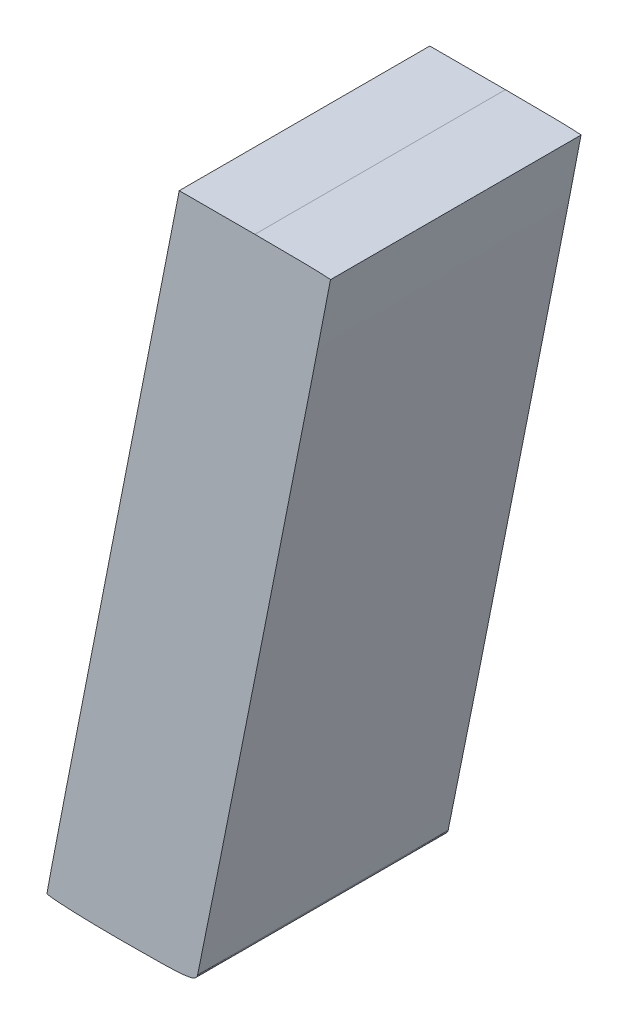
ISO-10303-21;
HEADER;
FILE_DESCRIPTION(('STEP AP214'),'2;1');
FILE_NAME('part.step','',(''),(''),'','','');
FILE_SCHEMA(('AUTOMOTIVE_DESIGN { 1 0 10303 214 1 1 1 1 }'));
ENDSEC;
DATA;
#1=APPLICATION_CONTEXT('core data for automotive mechanical design processes');
#2=APPLICATION_PROTOCOL_DEFINITION('international standard','automotive_design',2000,#1);
#3=PRODUCT_CONTEXT('',#1,'mechanical');
#4=PRODUCT('Part','Part','',(#3));
#5=PRODUCT_RELATED_PRODUCT_CATEGORY('part','',(#4));
#6=PRODUCT_DEFINITION_FORMATION('','',#4);
#7=PRODUCT_DEFINITION_CONTEXT('part definition',#1,'design');
#8=PRODUCT_DEFINITION('design','',#6,#7);
#9=PRODUCT_DEFINITION_SHAPE('','',#8);
#10=(LENGTH_UNIT() NAMED_UNIT(*) SI_UNIT(.MILLI.,.METRE.));
#11=(NAMED_UNIT(*) PLANE_ANGLE_UNIT() SI_UNIT($,.RADIAN.));
#12=(NAMED_UNIT(*) SI_UNIT($,.STERADIAN.) SOLID_ANGLE_UNIT());
#13=UNCERTAINTY_MEASURE_WITH_UNIT(LENGTH_MEASURE(1.E-05),#10,'distance_accuracy_value','');
#14=(GEOMETRIC_REPRESENTATION_CONTEXT(3) GLOBAL_UNCERTAINTY_ASSIGNED_CONTEXT((#13)) GLOBAL_UNIT_ASSIGNED_CONTEXT((#10,
#11,#12)) REPRESENTATION_CONTEXT('',''));
#15=CARTESIAN_POINT('',(0.,0.,0.));
#16=DIRECTION('',(0.,0.,1.));
#17=DIRECTION('',(1.,0.,0.));
#18=AXIS2_PLACEMENT_3D('',#15,#16,#17);
#19=CARTESIAN_POINT('',(0.466752008709,0.125494888964,0.));
#20=CARTESIAN_POINT('',(0.466752008709,0.125494888964,0.1));
#21=CARTESIAN_POINT('',(0.466752008709,0.125819781888,0.));
#22=CARTESIAN_POINT('',(0.466752008709,0.125819781888,0.1));
#23=CARTESIAN_POINT('',(0.453167898463,0.126085581458,0.));
#24=CARTESIAN_POINT('',(0.453167898463,0.126085581458,0.1));
#25=CARTESIAN_POINT('',(0.436565076449,0.126085581458,0.));
#26=CARTESIAN_POINT('',(0.436565076449,0.126085581458,0.1));
#27=B_SPLINE_SURFACE_WITH_KNOTS('',3,1,((#19,#20),(#21,#22),(#23,#24),(#25,#26)),.UNSPECIFIED.,
.F.,.F.,.F.,(4,4),(2,2),(0.,1.),(0.,0.01),.UNSPECIFIED.);
#28=CARTESIAN_POINT('',(0.466752008709,0.125494888964,0.));
#29=CARTESIAN_POINT('',(0.466752008709,0.125819781888,0.));
#30=CARTESIAN_POINT('',(0.453167898463,0.126085581458,0.));
#31=CARTESIAN_POINT('',(0.436565076449,0.126085581458,0.));
#32=B_SPLINE_CURVE_WITH_KNOTS('',3,(#28,#29,#30,#31),.UNSPECIFIED.,.F.,.F.,(4,4),(0.,1.),.UNSPECIFIED.);
#33=CARTESIAN_POINT('',(0.466752008709,0.125494888964,0.));
#34=VERTEX_POINT('',#33);
#35=CARTESIAN_POINT('',(0.436565076449,0.126085581458,0.));
#36=VERTEX_POINT('',#35);
#37=EDGE_CURVE('E11',#34,#36,#32,.T.);
#38=DIRECTION('',(0.,0.,1.));
#39=VECTOR('',#38,1.);
#40=CARTESIAN_POINT('',(0.436565076449,0.126085581458,0.));
#41=LINE('',#40,#39);
#42=CARTESIAN_POINT('',(0.436565076449,0.126085581458,0.1));
#43=VERTEX_POINT('',#42);
#44=EDGE_CURVE('E26',#36,#43,#41,.T.);
#45=CARTESIAN_POINT('',(0.466752008709,0.125494888964,0.1));
#46=CARTESIAN_POINT('',(0.466752008709,0.125819781888,0.1));
#47=CARTESIAN_POINT('',(0.453167898463,0.126085581458,0.1));
#48=CARTESIAN_POINT('',(0.436565076449,0.126085581458,0.1));
#49=B_SPLINE_CURVE_WITH_KNOTS('',3,(#45,#46,#47,#48),.UNSPECIFIED.,.F.,.F.,(4,4),(0.,1.),.UNSPECIFIED.);
#50=CARTESIAN_POINT('',(0.466752008709,0.125494888964,0.1));
#51=VERTEX_POINT('',#50);
#52=EDGE_CURVE('E96',#51,#43,#49,.T.);
#53=DIRECTION('',(0.,0.,1.));
#54=VECTOR('',#53,1.);
#55=CARTESIAN_POINT('',(0.466752008709,0.125494888964,0.));
#56=LINE('',#55,#54);
#57=EDGE_CURVE('E316',#34,#51,#56,.T.);
#58=ORIENTED_EDGE('',*,*,#37,.T.);
#59=ORIENTED_EDGE('',*,*,#44,.T.);
#60=ORIENTED_EDGE('',*,*,#52,.F.);
#61=ORIENTED_EDGE('',*,*,#57,.F.);
#62=EDGE_LOOP('',(#58,#59,#60,#61));
#63=FACE_BOUND('',#62,.T.);
#64=ADVANCED_FACE('F17',(#63),#27,.T.);
#65=CARTESIAN_POINT('',(0.413704830069,-0.14138271291666,0.));
#66=CARTESIAN_POINT('',(0.413704830069,-0.14138271291666,0.1));
#67=CARTESIAN_POINT('',(0.414569554781,-0.13850351115666,0.));
#68=CARTESIAN_POINT('',(0.414569554781,-0.13850351115666,0.1));
#69=CARTESIAN_POINT('',(0.466752008709,0.124023766684,0.));
#70=CARTESIAN_POINT('',(0.466752008709,0.124023766684,0.1));
#71=CARTESIAN_POINT('',(0.466752008709,0.125494888964,0.));
#72=CARTESIAN_POINT('',(0.466752008709,0.125494888964,0.1));
#73=B_SPLINE_SURFACE_WITH_KNOTS('',3,1,((#65,#66),(#67,#68),(#69,#70),(#71,#72)),.UNSPECIFIED.,
.F.,.F.,.F.,(4,4),(2,2),(0.,1.),(0.,0.01),.UNSPECIFIED.);
#74=CARTESIAN_POINT('',(0.413704830069,-0.14138271291666,0.));
#75=CARTESIAN_POINT('',(0.414569554781,-0.13850351115666,0.));
#76=CARTESIAN_POINT('',(0.466752008709,0.124023766684,0.));
#77=CARTESIAN_POINT('',(0.466752008709,0.125494888964,0.));
#78=B_SPLINE_CURVE_WITH_KNOTS('',3,(#74,#75,#76,#77),.UNSPECIFIED.,.F.,.F.,(4,4),(0.,1.),.UNSPECIFIED.);
#79=CARTESIAN_POINT('',(0.413704830069,-0.14138271291666,0.));
#80=VERTEX_POINT('',#79);
#81=EDGE_CURVE('E315',#80,#34,#78,.T.);
#82=CARTESIAN_POINT('',(0.466752008709,0.125494888964,0.1));
#83=CARTESIAN_POINT('',(0.466752008709,0.124023766684,0.1));
#84=CARTESIAN_POINT('',(0.414569554781,-0.13850351115666,0.1));
#85=CARTESIAN_POINT('',(0.413704830069,-0.14138271291666,0.1));
#86=B_SPLINE_CURVE_WITH_KNOTS('',3,(#82,#83,#84,#85),.UNSPECIFIED.,.F.,.F.,(4,4),(0.,1.),.UNSPECIFIED.);
#87=CARTESIAN_POINT('',(0.413704830069,-0.14138271291666,0.1));
#88=VERTEX_POINT('',#87);
#89=EDGE_CURVE('E207',#88,#51,#86,.F.);
#90=CARTESIAN_POINT('',(0.413704830069,-0.14138271291666,0.));
#91=CARTESIAN_POINT('',(0.413704830069,-0.14138271291666,0.00416666666666667));
#92=CARTESIAN_POINT('',(0.413704830069,-0.14138271291666,0.00833333333333334));
#93=CARTESIAN_POINT('',(0.413704830069,-0.14138271291666,0.0166666666666667));
#94=CARTESIAN_POINT('',(0.413704830069,-0.14138271291666,0.0208333333333333));
#95=CARTESIAN_POINT('',(0.413704830069,-0.14138271291666,0.0291666666666667));
#96=CARTESIAN_POINT('',(0.413704830069,-0.14138271291666,0.0333333333333333));
#97=CARTESIAN_POINT('',(0.413704830069,-0.14138271291666,0.0416666666666667));
#98=CARTESIAN_POINT('',(0.413704830069,-0.14138271291666,0.0458333333333333));
#99=CARTESIAN_POINT('',(0.413704830069,-0.14138271291666,0.0541666666666667));
#100=CARTESIAN_POINT('',(0.413704830069,-0.14138271291666,0.0583333333333333));
#101=CARTESIAN_POINT('',(0.413704830069,-0.14138271291666,0.0666666666666667));
#102=CARTESIAN_POINT('',(0.413704830069,-0.14138271291666,0.0708333333333333));
#103=CARTESIAN_POINT('',(0.413704830069,-0.14138271291666,0.0791666666666667));
#104=CARTESIAN_POINT('',(0.413704830069,-0.14138271291666,0.0833333333333333));
#105=CARTESIAN_POINT('',(0.413704830069,-0.14138271291666,0.0916666666666667));
#106=CARTESIAN_POINT('',(0.413704830069,-0.14138271291666,0.0958333333333333));
#107=CARTESIAN_POINT('',(0.413704830069,-0.14138271291666,0.1));
#108=B_SPLINE_CURVE_WITH_KNOTS('',3,(#90,#91,#92,#93,#94,#95,#96,#97,#98,#99,#100,#101,#102,
#103,#104,#105,#106,#107),.UNSPECIFIED.,.F.,.F.,(4,2,2,2,2,2,2,2,4),(0.,0.0125,0.025,0.0375,
0.05,0.0625,0.075,0.0875,0.1),.UNSPECIFIED.);
#109=EDGE_CURVE('E159',#80,#88,#108,.T.);
#110=ORIENTED_EDGE('',*,*,#81,.T.);
#111=ORIENTED_EDGE('',*,*,#57,.T.);
#112=ORIENTED_EDGE('',*,*,#89,.F.);
#113=ORIENTED_EDGE('',*,*,#109,.F.);
#114=EDGE_LOOP('',(#110,#111,#112,#113));
#115=FACE_BOUND('',#114,.T.);
#116=ADVANCED_FACE('F165',(#115),#73,.T.);
#117=CARTESIAN_POINT('',(0.383188054171,-0.14462756291666,0.));
#118=CARTESIAN_POINT('',(0.383188054171,-0.14462756291666,0.1));
#119=CARTESIAN_POINT('',(0.409716149197,-0.14462756291666,0.));
#120=CARTESIAN_POINT('',(0.409716149197,-0.14462756291666,0.1));
#121=CARTESIAN_POINT('',(0.412829740379,-0.14429649550666,0.));
#122=CARTESIAN_POINT('',(0.412829740379,-0.14429649550666,0.1));
#123=CARTESIAN_POINT('',(0.413704830069,-0.14138271291666,0.));
#124=CARTESIAN_POINT('',(0.413704830069,-0.14138271291666,0.1));
#125=B_SPLINE_SURFACE_WITH_KNOTS('',3,1,((#117,#118),(#119,#120),(#121,#122),(#123,#124)),
.UNSPECIFIED.,.F.,.F.,.F.,(4,4),(2,2),(0.,1.),(0.,0.01),.UNSPECIFIED.);
#126=CARTESIAN_POINT('',(0.383188054171,-0.14462756291666,0.));
#127=CARTESIAN_POINT('',(0.409716149197,-0.14462756291666,0.));
#128=CARTESIAN_POINT('',(0.412829740379,-0.14429649550666,0.));
#129=CARTESIAN_POINT('',(0.413704830069,-0.14138271291666,0.));
#130=B_SPLINE_CURVE_WITH_KNOTS('',3,(#126,#127,#128,#129),.UNSPECIFIED.,.F.,.F.,(4,4),(0.,1.),.UNSPECIFIED.);
#131=CARTESIAN_POINT('',(0.383188054171,-0.14462756291666,0.));
#132=VERTEX_POINT('',#131);
#133=EDGE_CURVE('E149',#132,#80,#130,.T.);
#134=CARTESIAN_POINT('',(0.383188054171,-0.14462756291666,0.1));
#135=CARTESIAN_POINT('',(0.409716149197,-0.14462756291666,0.1));
#136=CARTESIAN_POINT('',(0.412829740379,-0.14429649550666,0.1));
#137=CARTESIAN_POINT('',(0.413704830069,-0.14138271291666,0.1));
#138=B_SPLINE_CURVE_WITH_KNOTS('',3,(#134,#135,#136,#137),.UNSPECIFIED.,.F.,.F.,(4,4),(0.,1.),.UNSPECIFIED.);
#139=CARTESIAN_POINT('',(0.383188054171,-0.14462756291666,0.1));
#140=VERTEX_POINT('',#139);
#141=EDGE_CURVE('E139',#140,#88,#138,.T.);
#142=DIRECTION('',(0.,0.,1.));
#143=VECTOR('',#142,1.);
#144=CARTESIAN_POINT('',(0.383188054171,-0.14462756291666,0.));
#145=LINE('',#144,#143);
#146=EDGE_CURVE('E133',#132,#140,#145,.T.);
#147=ORIENTED_EDGE('',*,*,#133,.T.);
#148=ORIENTED_EDGE('',*,*,#109,.T.);
#149=ORIENTED_EDGE('',*,*,#141,.F.);
#150=ORIENTED_EDGE('',*,*,#146,.F.);
#151=EDGE_LOOP('',(#147,#148,#149,#150));
#152=FACE_BOUND('',#151,.T.);
#153=ADVANCED_FACE('F176',(#152),#125,.T.);
#154=CARTESIAN_POINT('',(0.353584881328327,-0.143236949919647,0.));
#155=CARTESIAN_POINT('',(0.353584881328327,-0.143236949919647,0.1));
#156=CARTESIAN_POINT('',(0.353618814744494,-0.144001790600004,0.));
#157=CARTESIAN_POINT('',(0.353618814744494,-0.144001790600004,0.1));
#158=CARTESIAN_POINT('',(0.366940091389674,-0.14462756291666,0.));
#159=CARTESIAN_POINT('',(0.366940091389674,-0.14462756291666,0.1));
#160=CARTESIAN_POINT('',(0.383188054171,-0.14462756291666,0.));
#161=CARTESIAN_POINT('',(0.383188054171,-0.14462756291666,0.1));
#162=B_SPLINE_SURFACE_WITH_KNOTS('',3,1,((#154,#155),(#156,#157),(#158,#159),(#160,#161)),
.UNSPECIFIED.,.F.,.F.,.F.,(4,4),(2,2),(0.,0.999983873642988),(0.,0.01),.UNSPECIFIED.);
#163=CARTESIAN_POINT('',(0.353584881328327,-0.143236949919647,0.));
#164=CARTESIAN_POINT('',(0.353618814744494,-0.144001790600004,0.));
#165=CARTESIAN_POINT('',(0.366940091389674,-0.14462756291666,0.));
#166=CARTESIAN_POINT('',(0.383188054171,-0.14462756291666,0.));
#167=B_SPLINE_CURVE_WITH_KNOTS('',3,(#163,#164,#165,#166),.UNSPECIFIED.,.F.,.F.,(4,4),(0.,
0.999983873642988),.UNSPECIFIED.);
#168=CARTESIAN_POINT('',(0.353584881328327,-0.143236949919647,0.));
#169=VERTEX_POINT('',#168);
#170=EDGE_CURVE('E125',#169,#132,#167,.T.);
#171=CARTESIAN_POINT('',(0.353584881328327,-0.143236949919647,0.1));
#172=CARTESIAN_POINT('',(0.353618814744494,-0.144001790600004,0.1));
#173=CARTESIAN_POINT('',(0.366940091389674,-0.14462756291666,0.1));
#174=CARTESIAN_POINT('',(0.383188054171,-0.14462756291666,0.1));
#175=B_SPLINE_CURVE_WITH_KNOTS('',3,(#171,#172,#173,#174),.UNSPECIFIED.,.F.,.F.,(4,4),(0.,
0.999983873642988),.UNSPECIFIED.);
#176=CARTESIAN_POINT('',(0.353584881328327,-0.143236949919647,0.1));
#177=VERTEX_POINT('',#176);
#178=EDGE_CURVE('E120',#177,#140,#175,.T.);
#179=DIRECTION('',(0.,0.,1.));
#180=VECTOR('',#179,1.);
#181=CARTESIAN_POINT('',(0.353584881328327,-0.143236949919647,0.));
#182=LINE('',#181,#180);
#183=EDGE_CURVE('E114',#169,#177,#182,.T.);
#184=ORIENTED_EDGE('',*,*,#170,.T.);
#185=ORIENTED_EDGE('',*,*,#146,.T.);
#186=ORIENTED_EDGE('',*,*,#178,.F.);
#187=ORIENTED_EDGE('',*,*,#183,.F.);
#188=EDGE_LOOP('',(#184,#185,#186,#187));
#189=FACE_BOUND('',#188,.T.);
#190=ADVANCED_FACE('F232',(#189),#162,.T.);
#191=CARTESIAN_POINT('',(0.379951047437,-0.00788036854199998,0.));
#192=CARTESIAN_POINT('',(0.379951047437,-0.00788036854199998,0.1));
#193=CARTESIAN_POINT('',(0.365416259131235,-0.0815610464368766,0.));
#194=CARTESIAN_POINT('',(0.365416259131235,-0.0815610464368766,0.1));
#195=CARTESIAN_POINT('',(0.353551512587128,-0.1424711279403,0.));
#196=CARTESIAN_POINT('',(0.353551512587128,-0.1424711279403,0.1));
#197=CARTESIAN_POINT('',(0.353584881328327,-0.143236949919647,0.));
#198=CARTESIAN_POINT('',(0.353584881328327,-0.143236949919647,0.1));
#199=B_SPLINE_SURFACE_WITH_KNOTS('',3,1,((#191,#192),(#193,#194),(#195,#196),(#197,#198)),
.UNSPECIFIED.,.F.,.F.,.F.,(4,4),(2,2),(8.06929863061967E-06,1.),(0.,0.01),.UNSPECIFIED.);
#200=CARTESIAN_POINT('',(0.379951047437,-0.00788036854199998,0.));
#201=CARTESIAN_POINT('',(0.365416259131235,-0.0815610464368766,0.));
#202=CARTESIAN_POINT('',(0.353551512587128,-0.1424711279403,0.));
#203=CARTESIAN_POINT('',(0.353584881328327,-0.143236949919647,0.));
#204=B_SPLINE_CURVE_WITH_KNOTS('',3,(#200,#201,#202,#203),.UNSPECIFIED.,.F.,.F.,(4,4),
(8.06929863061967E-06,1.),.UNSPECIFIED.);
#205=CARTESIAN_POINT('',(0.379951047437,-0.00788036854199998,0.));
#206=VERTEX_POINT('',#205);
#207=EDGE_CURVE('E106',#206,#169,#204,.T.);
#208=CARTESIAN_POINT('',(0.379951047437,-0.00788036854199998,0.1));
#209=CARTESIAN_POINT('',(0.365416259131235,-0.0815610464368766,0.1));
#210=CARTESIAN_POINT('',(0.353551512587128,-0.1424711279403,0.1));
#211=CARTESIAN_POINT('',(0.353584881328327,-0.143236949919647,0.1));
#212=B_SPLINE_CURVE_WITH_KNOTS('',3,(#208,#209,#210,#211),.UNSPECIFIED.,.F.,.F.,(4,4),
(8.06929863061967E-06,1.),.UNSPECIFIED.);
#213=CARTESIAN_POINT('',(0.379951047437,-0.00788036854199998,0.1));
#214=VERTEX_POINT('',#213);
#215=EDGE_CURVE('E102',#214,#177,#212,.T.);
#216=DIRECTION('',(0.,0.,1.));
#217=VECTOR('',#216,1.);
#218=CARTESIAN_POINT('',(0.379951047437,-0.00788036854199998,0.));
#219=LINE('',#218,#217);
#220=EDGE_CURVE('E81',#206,#214,#219,.T.);
#221=ORIENTED_EDGE('',*,*,#207,.T.);
#222=ORIENTED_EDGE('',*,*,#183,.T.);
#223=ORIENTED_EDGE('',*,*,#215,.F.);
#224=ORIENTED_EDGE('',*,*,#220,.F.);
#225=EDGE_LOOP('',(#221,#222,#223,#224));
#226=FACE_BOUND('',#225,.T.);
#227=ADVANCED_FACE('F228',(#226),#199,.T.);
#228=CARTESIAN_POINT('',(0.406378144189,0.126085581458,0.));
#229=DIRECTION('',(-0.981092876478145,0.193537509862662,0.));
#230=DIRECTION('',(-0.193537509862662,-0.981092876478145,0.));
#231=AXIS2_PLACEMENT_3D('',#228,#229,#230);
#232=PLANE('',#231);
#233=DIRECTION('',(-0.193537509862662,-0.981092876478145,0.));
#234=VECTOR('',#233,1.);
#235=CARTESIAN_POINT('',(0.406378144189,0.126085581458,0.));
#236=LINE('',#235,#234);
#237=CARTESIAN_POINT('',(0.406378144189,0.126085581458,0.));
#238=VERTEX_POINT('',#237);
#239=EDGE_CURVE('E85',#238,#206,#236,.T.);
#240=ORIENTED_EDGE('',*,*,#239,.T.);
#241=ORIENTED_EDGE('',*,*,#220,.T.);
#242=DIRECTION('',(-0.193537509862662,-0.981092876478145,0.));
#243=VECTOR('',#242,1.);
#244=CARTESIAN_POINT('',(0.406378144189,0.126085581458,0.1));
#245=LINE('',#244,#243);
#246=CARTESIAN_POINT('',(0.406378144189,0.126085581458,0.1));
#247=VERTEX_POINT('',#246);
#248=EDGE_CURVE('E74',#247,#214,#245,.T.);
#249=ORIENTED_EDGE('',*,*,#248,.F.);
#250=DIRECTION('',(0.,0.,1.));
#251=VECTOR('',#250,1.);
#252=CARTESIAN_POINT('',(0.406378144189,0.126085581458,0.));
#253=LINE('',#252,#251);
#254=EDGE_CURVE('E78',#238,#247,#253,.T.);
#255=ORIENTED_EDGE('',*,*,#254,.F.);
#256=EDGE_LOOP('',(#240,#241,#249,#255));
#257=FACE_BOUND('',#256,.T.);
#258=ADVANCED_FACE('F77',(#257),#232,.T.);
#259=CARTESIAN_POINT('',(0.436565076449,0.126085581458,0.));
#260=DIRECTION('',(0.,1.,0.));
#261=DIRECTION('',(-1.,0.,0.));
#262=AXIS2_PLACEMENT_3D('',#259,#260,#261);
#263=PLANE('',#262);
#264=DIRECTION('',(-1.,0.,0.));
#265=VECTOR('',#264,1.);
#266=CARTESIAN_POINT('',(0.436565076449,0.126085581458,0.));
#267=LINE('',#266,#265);
#268=EDGE_CURVE('E91',#36,#238,#267,.T.);
#269=ORIENTED_EDGE('',*,*,#268,.T.);
#270=ORIENTED_EDGE('',*,*,#254,.T.);
#271=DIRECTION('',(-1.,0.,0.));
#272=VECTOR('',#271,1.);
#273=CARTESIAN_POINT('',(0.436565076449,0.126085581458,0.1));
#274=LINE('',#273,#272);
#275=EDGE_CURVE('E90',#43,#247,#274,.T.);
#276=ORIENTED_EDGE('',*,*,#275,.F.);
#277=ORIENTED_EDGE('',*,*,#44,.F.);
#278=EDGE_LOOP('',(#269,#270,#276,#277));
#279=FACE_BOUND('',#278,.T.);
#280=ADVANCED_FACE('F89',(#279),#263,.T.);
#281=CARTESIAN_POINT('',(0.409121241032325,-0.00247349762688304,0.1));
#282=DIRECTION('',(0.,0.,1.));
#283=DIRECTION('',(1.,0.,0.));
#284=AXIS2_PLACEMENT_3D('',#281,#282,#283);
#285=PLANE('',#284);
#286=ORIENTED_EDGE('',*,*,#275,.T.);
#287=ORIENTED_EDGE('',*,*,#248,.T.);
#288=ORIENTED_EDGE('',*,*,#215,.T.);
#289=ORIENTED_EDGE('',*,*,#178,.T.);
#290=ORIENTED_EDGE('',*,*,#141,.T.);
#291=ORIENTED_EDGE('',*,*,#89,.T.);
#292=ORIENTED_EDGE('',*,*,#52,.T.);
#293=EDGE_LOOP('',(#286,#287,#288,#289,#290,#291,#292));
#294=FACE_BOUND('',#293,.T.);
#295=ADVANCED_FACE('F94',(#294),#285,.T.);
#296=CARTESIAN_POINT('',(0.409121241032325,-0.00247349762688304,0.));
#297=DIRECTION('',(0.,0.,1.));
#298=DIRECTION('',(1.,0.,0.));
#299=AXIS2_PLACEMENT_3D('',#296,#297,#298);
#300=PLANE('',#299);
#301=ORIENTED_EDGE('',*,*,#268,.F.);
#302=ORIENTED_EDGE('',*,*,#37,.F.);
#303=ORIENTED_EDGE('',*,*,#81,.F.);
#304=ORIENTED_EDGE('',*,*,#133,.F.);
#305=ORIENTED_EDGE('',*,*,#170,.F.);
#306=ORIENTED_EDGE('',*,*,#207,.F.);
#307=ORIENTED_EDGE('',*,*,#239,.F.);
#308=EDGE_LOOP('',(#301,#302,#303,#304,#305,#306,#307));
#309=FACE_BOUND('',#308,.T.);
#310=ADVANCED_FACE('F222',(#309),#300,.F.);
#311=CLOSED_SHELL('',(#64,#116,#153,#190,#227,#258,#280,#295,#310));
#312=MANIFOLD_SOLID_BREP('B1',#311);
#313=ADVANCED_BREP_SHAPE_REPRESENTATION('',(#18,#312),#14);
#314=SHAPE_DEFINITION_REPRESENTATION(#9,#313);
ENDSEC;
END-ISO-10303-21;
